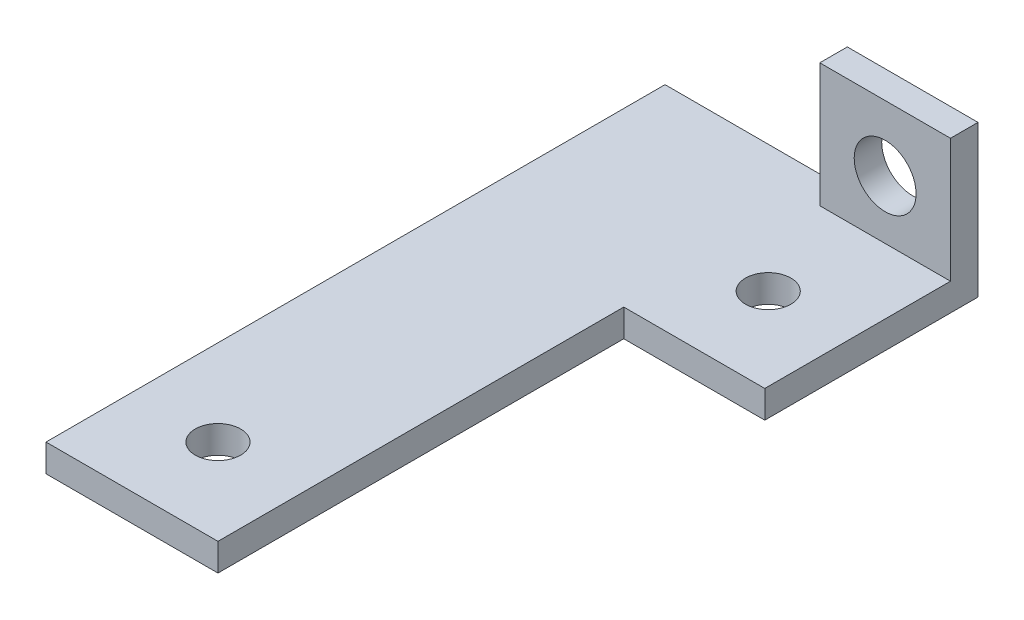
ISO-10303-21;
HEADER;
FILE_DESCRIPTION(('STEP AP214'),'2;1');
FILE_NAME('part.step','',(''),(''),'','','');
FILE_SCHEMA(('AUTOMOTIVE_DESIGN { 1 0 10303 214 1 1 1 1 }'));
ENDSEC;
DATA;
#1=APPLICATION_CONTEXT('core data for automotive mechanical design processes');
#2=APPLICATION_PROTOCOL_DEFINITION('international standard','automotive_design',2000,#1);
#3=PRODUCT_CONTEXT('',#1,'mechanical');
#4=PRODUCT('Part','Part','',(#3));
#5=PRODUCT_RELATED_PRODUCT_CATEGORY('part','',(#4));
#6=PRODUCT_DEFINITION_FORMATION('','',#4);
#7=PRODUCT_DEFINITION_CONTEXT('part definition',#1,'design');
#8=PRODUCT_DEFINITION('design','',#6,#7);
#9=PRODUCT_DEFINITION_SHAPE('','',#8);
#10=(LENGTH_UNIT() NAMED_UNIT(*) SI_UNIT(.MILLI.,.METRE.));
#11=(NAMED_UNIT(*) PLANE_ANGLE_UNIT() SI_UNIT($,.RADIAN.));
#12=(NAMED_UNIT(*) SI_UNIT($,.STERADIAN.) SOLID_ANGLE_UNIT());
#13=UNCERTAINTY_MEASURE_WITH_UNIT(LENGTH_MEASURE(1.E-05),#10,'distance_accuracy_value','');
#14=(GEOMETRIC_REPRESENTATION_CONTEXT(3) GLOBAL_UNCERTAINTY_ASSIGNED_CONTEXT((#13)) GLOBAL_UNIT_ASSIGNED_CONTEXT((#10,
#11,#12)) REPRESENTATION_CONTEXT('',''));
#15=CARTESIAN_POINT('',(0.,0.,0.));
#16=DIRECTION('',(0.,0.,1.));
#17=DIRECTION('',(1.,0.,0.));
#18=AXIS2_PLACEMENT_3D('',#15,#16,#17);
#19=CARTESIAN_POINT('',(0.,4.,0.));
#20=DIRECTION('',(0.,-1.,0.));
#21=DIRECTION('',(0.,0.,-1.));
#22=AXIS2_PLACEMENT_3D('',#19,#20,#21);
#23=PLANE('',#22);
#24=CARTESIAN_POINT('',(12.5,4.,-12.5));
#25=DIRECTION('',(0.,1.,0.));
#26=DIRECTION('',(0.,0.,1.));
#27=AXIS2_PLACEMENT_3D('',#24,#25,#26);
#28=CIRCLE('',#27,3.3);
#29=CARTESIAN_POINT('',(12.5,4.,-9.2));
#30=VERTEX_POINT('',#29);
#31=EDGE_CURVE('E133',#30,#30,#28,.T.);
#32=ORIENTED_EDGE('',*,*,#31,.F.);
#33=EDGE_LOOP('',(#32));
#34=FACE_BOUND('',#33,.T.);
#35=CARTESIAN_POINT('',(33.5,4.,-71.5));
#36=DIRECTION('',(0.,1.,0.));
#37=DIRECTION('',(0.,0.,1.));
#38=AXIS2_PLACEMENT_3D('',#35,#36,#37);
#39=CIRCLE('',#38,3.3);
#40=CARTESIAN_POINT('',(33.5,4.,-68.2));
#41=VERTEX_POINT('',#40);
#42=EDGE_CURVE('E142',#41,#41,#39,.T.);
#43=ORIENTED_EDGE('',*,*,#42,.F.);
#44=EDGE_LOOP('',(#43));
#45=FACE_BOUND('',#44,.T.);
#46=DIRECTION('',(1.,0.,0.));
#47=VECTOR('',#46,1.);
#48=CARTESIAN_POINT('',(45.5,4.,-86.));
#49=LINE('',#48,#47);
#50=CARTESIAN_POINT('',(26.5,4.,-86.));
#51=VERTEX_POINT('',#50);
#52=CARTESIAN_POINT('',(45.5,4.,-86.));
#53=VERTEX_POINT('',#52);
#54=EDGE_CURVE('E125',#51,#53,#49,.T.);
#55=ORIENTED_EDGE('',*,*,#54,.F.);
#56=DIRECTION('',(0.,0.,1.));
#57=VECTOR('',#56,1.);
#58=CARTESIAN_POINT('',(26.5,4.,-90.));
#59=LINE('',#58,#57);
#60=CARTESIAN_POINT('',(26.5,4.,-90.));
#61=VERTEX_POINT('',#60);
#62=EDGE_CURVE('E51',#61,#51,#59,.T.);
#63=ORIENTED_EDGE('',*,*,#62,.F.);
#64=DIRECTION('',(-1.,0.,0.));
#65=VECTOR('',#64,1.);
#66=CARTESIAN_POINT('',(0.,4.,-90.));
#67=LINE('',#66,#65);
#68=CARTESIAN_POINT('',(0.,4.,-90.));
#69=VERTEX_POINT('',#68);
#70=EDGE_CURVE('E129',#61,#69,#67,.T.);
#71=ORIENTED_EDGE('',*,*,#70,.T.);
#72=DIRECTION('',(0.,0.,1.));
#73=VECTOR('',#72,1.);
#74=CARTESIAN_POINT('',(0.,4.,0.));
#75=LINE('',#74,#73);
#76=CARTESIAN_POINT('',(0.,4.,0.));
#77=VERTEX_POINT('',#76);
#78=EDGE_CURVE('E148',#69,#77,#75,.T.);
#79=ORIENTED_EDGE('',*,*,#78,.T.);
#80=DIRECTION('',(1.,0.,0.));
#81=VECTOR('',#80,1.);
#82=CARTESIAN_POINT('',(0.,4.,0.));
#83=LINE('',#82,#81);
#84=CARTESIAN_POINT('',(25.,4.,0.));
#85=VERTEX_POINT('',#84);
#86=EDGE_CURVE('E151',#77,#85,#83,.T.);
#87=ORIENTED_EDGE('',*,*,#86,.T.);
#88=DIRECTION('',(0.,0.,-1.));
#89=VECTOR('',#88,1.);
#90=CARTESIAN_POINT('',(25.,4.,-59.));
#91=LINE('',#90,#89);
#92=CARTESIAN_POINT('',(25.,4.,-59.));
#93=VERTEX_POINT('',#92);
#94=EDGE_CURVE('E154',#85,#93,#91,.T.);
#95=ORIENTED_EDGE('',*,*,#94,.T.);
#96=DIRECTION('',(1.,0.,0.));
#97=VECTOR('',#96,1.);
#98=CARTESIAN_POINT('',(45.5,4.,-59.));
#99=LINE('',#98,#97);
#100=CARTESIAN_POINT('',(45.5,4.,-59.));
#101=VERTEX_POINT('',#100);
#102=EDGE_CURVE('E156',#93,#101,#99,.T.);
#103=ORIENTED_EDGE('',*,*,#102,.T.);
#104=DIRECTION('',(0.,0.,-1.));
#105=VECTOR('',#104,1.);
#106=CARTESIAN_POINT('',(45.5,4.,-90.));
#107=LINE('',#106,#105);
#108=EDGE_CURVE('E57',#101,#53,#107,.T.);
#109=ORIENTED_EDGE('',*,*,#108,.T.);
#110=EDGE_LOOP('',(#55,#63,#71,#79,#87,#95,#103,#109));
#111=FACE_BOUND('',#110,.T.);
#112=ADVANCED_FACE('F36',(#34,#45,#111),#23,.F.);
#113=CARTESIAN_POINT('',(0.,0.,0.));
#114=DIRECTION('',(0.,-1.,0.));
#115=DIRECTION('',(0.,0.,-1.));
#116=AXIS2_PLACEMENT_3D('',#113,#114,#115);
#117=PLANE('',#116);
#118=CARTESIAN_POINT('',(33.5,0.,-71.5));
#119=DIRECTION('',(0.,1.,0.));
#120=DIRECTION('',(0.,0.,1.));
#121=AXIS2_PLACEMENT_3D('',#118,#119,#120);
#122=CIRCLE('',#121,3.3);
#123=CARTESIAN_POINT('',(33.5,0.,-68.2));
#124=VERTEX_POINT('',#123);
#125=EDGE_CURVE('E140',#124,#124,#122,.T.);
#126=ORIENTED_EDGE('',*,*,#125,.T.);
#127=EDGE_LOOP('',(#126));
#128=FACE_BOUND('',#127,.T.);
#129=DIRECTION('',(0.,0.,1.));
#130=VECTOR('',#129,1.);
#131=CARTESIAN_POINT('',(0.,0.,0.));
#132=LINE('',#131,#130);
#133=CARTESIAN_POINT('',(0.,0.,-90.));
#134=VERTEX_POINT('',#133);
#135=CARTESIAN_POINT('',(0.,0.,0.));
#136=VERTEX_POINT('',#135);
#137=EDGE_CURVE('E145',#134,#136,#132,.T.);
#138=ORIENTED_EDGE('',*,*,#137,.F.);
#139=DIRECTION('',(-1.,0.,0.));
#140=VECTOR('',#139,1.);
#141=CARTESIAN_POINT('',(0.,0.,-90.));
#142=LINE('',#141,#140);
#143=CARTESIAN_POINT('',(45.5,0.,-90.));
#144=VERTEX_POINT('',#143);
#145=EDGE_CURVE('E152',#144,#134,#142,.T.);
#146=ORIENTED_EDGE('',*,*,#145,.F.);
#147=DIRECTION('',(0.,0.,-1.));
#148=VECTOR('',#147,1.);
#149=CARTESIAN_POINT('',(45.5,0.,-90.));
#150=LINE('',#149,#148);
#151=CARTESIAN_POINT('',(45.5,0.,-59.));
#152=VERTEX_POINT('',#151);
#153=EDGE_CURVE('E169',#152,#144,#150,.T.);
#154=ORIENTED_EDGE('',*,*,#153,.F.);
#155=DIRECTION('',(1.,0.,0.));
#156=VECTOR('',#155,1.);
#157=CARTESIAN_POINT('',(45.5,0.,-59.));
#158=LINE('',#157,#156);
#159=CARTESIAN_POINT('',(25.,0.,-59.));
#160=VERTEX_POINT('',#159);
#161=EDGE_CURVE('E167',#160,#152,#158,.T.);
#162=ORIENTED_EDGE('',*,*,#161,.F.);
#163=DIRECTION('',(0.,0.,-1.));
#164=VECTOR('',#163,1.);
#165=CARTESIAN_POINT('',(25.,0.,-59.));
#166=LINE('',#165,#164);
#167=CARTESIAN_POINT('',(25.,0.,0.));
#168=VERTEX_POINT('',#167);
#169=EDGE_CURVE('E165',#168,#160,#166,.T.);
#170=ORIENTED_EDGE('',*,*,#169,.F.);
#171=DIRECTION('',(1.,0.,0.));
#172=VECTOR('',#171,1.);
#173=CARTESIAN_POINT('',(0.,0.,0.));
#174=LINE('',#173,#172);
#175=EDGE_CURVE('E163',#136,#168,#174,.T.);
#176=ORIENTED_EDGE('',*,*,#175,.F.);
#177=EDGE_LOOP('',(#138,#146,#154,#162,#170,#176));
#178=FACE_BOUND('',#177,.T.);
#179=CARTESIAN_POINT('',(12.5,0.,-12.5));
#180=DIRECTION('',(0.,1.,0.));
#181=DIRECTION('',(0.,0.,1.));
#182=AXIS2_PLACEMENT_3D('',#179,#180,#181);
#183=CIRCLE('',#182,3.3);
#184=CARTESIAN_POINT('',(12.5,0.,-9.2));
#185=VERTEX_POINT('',#184);
#186=EDGE_CURVE('E130',#185,#185,#183,.T.);
#187=ORIENTED_EDGE('',*,*,#186,.T.);
#188=EDGE_LOOP('',(#187));
#189=FACE_BOUND('',#188,.T.);
#190=ADVANCED_FACE('F192',(#128,#178,#189),#117,.T.);
#191=CARTESIAN_POINT('',(0.,4.,0.));
#192=DIRECTION('',(1.,0.,0.));
#193=DIRECTION('',(0.,0.,-1.));
#194=AXIS2_PLACEMENT_3D('',#191,#192,#193);
#195=PLANE('',#194);
#196=ORIENTED_EDGE('',*,*,#137,.T.);
#197=DIRECTION('',(0.,-1.,0.));
#198=VECTOR('',#197,1.);
#199=CARTESIAN_POINT('',(0.,4.,0.));
#200=LINE('',#199,#198);
#201=EDGE_CURVE('E11',#77,#136,#200,.T.);
#202=ORIENTED_EDGE('',*,*,#201,.F.);
#203=ORIENTED_EDGE('',*,*,#78,.F.);
#204=DIRECTION('',(0.,-1.,0.));
#205=VECTOR('',#204,1.);
#206=CARTESIAN_POINT('',(0.,4.,-90.));
#207=LINE('',#206,#205);
#208=EDGE_CURVE('E160',#69,#134,#207,.T.);
#209=ORIENTED_EDGE('',*,*,#208,.T.);
#210=EDGE_LOOP('',(#196,#202,#203,#209));
#211=FACE_BOUND('',#210,.T.);
#212=ADVANCED_FACE('F38',(#211),#195,.F.);
#213=CARTESIAN_POINT('',(0.,4.,0.));
#214=DIRECTION('',(0.,0.,-1.));
#215=DIRECTION('',(-1.,0.,0.));
#216=AXIS2_PLACEMENT_3D('',#213,#214,#215);
#217=PLANE('',#216);
#218=ORIENTED_EDGE('',*,*,#175,.T.);
#219=DIRECTION('',(0.,-1.,0.));
#220=VECTOR('',#219,1.);
#221=CARTESIAN_POINT('',(25.,4.,0.));
#222=LINE('',#221,#220);
#223=EDGE_CURVE('E44',#85,#168,#222,.T.);
#224=ORIENTED_EDGE('',*,*,#223,.F.);
#225=ORIENTED_EDGE('',*,*,#86,.F.);
#226=ORIENTED_EDGE('',*,*,#201,.T.);
#227=EDGE_LOOP('',(#218,#224,#225,#226));
#228=FACE_BOUND('',#227,.T.);
#229=ADVANCED_FACE('F320',(#228),#217,.F.);
#230=CARTESIAN_POINT('',(25.,4.,-59.));
#231=DIRECTION('',(-1.,0.,0.));
#232=DIRECTION('',(0.,0.,1.));
#233=AXIS2_PLACEMENT_3D('',#230,#231,#232);
#234=PLANE('',#233);
#235=ORIENTED_EDGE('',*,*,#169,.T.);
#236=DIRECTION('',(0.,-1.,0.));
#237=VECTOR('',#236,1.);
#238=CARTESIAN_POINT('',(25.,4.,-59.));
#239=LINE('',#238,#237);
#240=EDGE_CURVE('E179',#93,#160,#239,.T.);
#241=ORIENTED_EDGE('',*,*,#240,.F.);
#242=ORIENTED_EDGE('',*,*,#94,.F.);
#243=ORIENTED_EDGE('',*,*,#223,.T.);
#244=EDGE_LOOP('',(#235,#241,#242,#243));
#245=FACE_BOUND('',#244,.T.);
#246=ADVANCED_FACE('F186',(#245),#234,.F.);
#247=CARTESIAN_POINT('',(45.5,4.,-59.));
#248=DIRECTION('',(0.,0.,-1.));
#249=DIRECTION('',(-1.,0.,0.));
#250=AXIS2_PLACEMENT_3D('',#247,#248,#249);
#251=PLANE('',#250);
#252=ORIENTED_EDGE('',*,*,#161,.T.);
#253=DIRECTION('',(0.,-1.,0.));
#254=VECTOR('',#253,1.);
#255=CARTESIAN_POINT('',(45.5,4.,-59.));
#256=LINE('',#255,#254);
#257=EDGE_CURVE('E176',#101,#152,#256,.T.);
#258=ORIENTED_EDGE('',*,*,#257,.F.);
#259=ORIENTED_EDGE('',*,*,#102,.F.);
#260=ORIENTED_EDGE('',*,*,#240,.T.);
#261=EDGE_LOOP('',(#252,#258,#259,#260));
#262=FACE_BOUND('',#261,.T.);
#263=ADVANCED_FACE('F198',(#262),#251,.F.);
#264=CARTESIAN_POINT('',(45.5,4.,-90.));
#265=DIRECTION('',(-1.,0.,0.));
#266=DIRECTION('',(0.,0.,1.));
#267=AXIS2_PLACEMENT_3D('',#264,#265,#266);
#268=PLANE('',#267);
#269=ORIENTED_EDGE('',*,*,#153,.T.);
#270=DIRECTION('',(0.,-1.,0.));
#271=VECTOR('',#270,1.);
#272=CARTESIAN_POINT('',(45.5,4.,-90.));
#273=LINE('',#272,#271);
#274=CARTESIAN_POINT('',(45.5,22.,-90.));
#275=VERTEX_POINT('',#274);
#276=EDGE_CURVE('E174',#275,#144,#273,.T.);
#277=ORIENTED_EDGE('',*,*,#276,.F.);
#278=DIRECTION('',(0.,0.,-1.));
#279=VECTOR('',#278,1.);
#280=CARTESIAN_POINT('',(45.5,22.,-90.));
#281=LINE('',#280,#279);
#282=CARTESIAN_POINT('',(45.5,22.,-86.));
#283=VERTEX_POINT('',#282);
#284=EDGE_CURVE('E122',#283,#275,#281,.T.);
#285=ORIENTED_EDGE('',*,*,#284,.F.);
#286=DIRECTION('',(0.,-1.,0.));
#287=VECTOR('',#286,1.);
#288=CARTESIAN_POINT('',(45.5,22.,-86.));
#289=LINE('',#288,#287);
#290=EDGE_CURVE('E135',#283,#53,#289,.T.);
#291=ORIENTED_EDGE('',*,*,#290,.T.);
#292=ORIENTED_EDGE('',*,*,#108,.F.);
#293=ORIENTED_EDGE('',*,*,#257,.T.);
#294=EDGE_LOOP('',(#269,#277,#285,#291,#292,#293));
#295=FACE_BOUND('',#294,.T.);
#296=ADVANCED_FACE('F201',(#295),#268,.F.);
#297=CARTESIAN_POINT('',(0.,4.,-90.));
#298=DIRECTION('',(0.,0.,1.));
#299=DIRECTION('',(1.,0.,0.));
#300=AXIS2_PLACEMENT_3D('',#297,#298,#299);
#301=PLANE('',#300);
#302=CARTESIAN_POINT('',(36.,12.5,-90.));
#303=DIRECTION('',(0.,0.,-1.));
#304=DIRECTION('',(-1.,0.,0.));
#305=AXIS2_PLACEMENT_3D('',#302,#303,#304);
#306=CIRCLE('',#305,4.5);
#307=CARTESIAN_POINT('',(31.5,12.5,-90.));
#308=VERTEX_POINT('',#307);
#309=EDGE_CURVE('E211',#308,#308,#306,.T.);
#310=ORIENTED_EDGE('',*,*,#309,.F.);
#311=EDGE_LOOP('',(#310));
#312=FACE_BOUND('',#311,.T.);
#313=ORIENTED_EDGE('',*,*,#145,.T.);
#314=ORIENTED_EDGE('',*,*,#208,.F.);
#315=ORIENTED_EDGE('',*,*,#70,.F.);
#316=DIRECTION('',(0.,-1.,0.));
#317=VECTOR('',#316,1.);
#318=CARTESIAN_POINT('',(26.5,22.,-90.));
#319=LINE('',#318,#317);
#320=CARTESIAN_POINT('',(26.5,22.,-90.));
#321=VERTEX_POINT('',#320);
#322=EDGE_CURVE('E110',#321,#61,#319,.T.);
#323=ORIENTED_EDGE('',*,*,#322,.F.);
#324=DIRECTION('',(-1.,0.,0.));
#325=VECTOR('',#324,1.);
#326=CARTESIAN_POINT('',(45.5,22.,-90.));
#327=LINE('',#326,#325);
#328=EDGE_CURVE('E116',#275,#321,#327,.T.);
#329=ORIENTED_EDGE('',*,*,#328,.F.);
#330=ORIENTED_EDGE('',*,*,#276,.T.);
#331=EDGE_LOOP('',(#313,#314,#315,#323,#329,#330));
#332=FACE_BOUND('',#331,.T.);
#333=ADVANCED_FACE('F127',(#312,#332),#301,.F.);
#334=CARTESIAN_POINT('',(33.5,4.,-71.5));
#335=DIRECTION('',(0.,-1.,0.));
#336=DIRECTION('',(0.,0.,-1.));
#337=AXIS2_PLACEMENT_3D('',#334,#335,#336);
#338=CYLINDRICAL_SURFACE('',#337,3.3);
#339=ORIENTED_EDGE('',*,*,#42,.T.);
#340=EDGE_LOOP('',(#339));
#341=FACE_BOUND('',#340,.T.);
#342=ORIENTED_EDGE('',*,*,#125,.F.);
#343=EDGE_LOOP('',(#342));
#344=FACE_BOUND('',#343,.T.);
#345=ADVANCED_FACE('F226',(#341,#344),#338,.F.);
#346=CARTESIAN_POINT('',(12.5,4.,-12.5));
#347=DIRECTION('',(0.,-1.,0.));
#348=DIRECTION('',(0.,0.,-1.));
#349=AXIS2_PLACEMENT_3D('',#346,#347,#348);
#350=CYLINDRICAL_SURFACE('',#349,3.3);
#351=ORIENTED_EDGE('',*,*,#31,.T.);
#352=EDGE_LOOP('',(#351));
#353=FACE_BOUND('',#352,.T.);
#354=ORIENTED_EDGE('',*,*,#186,.F.);
#355=EDGE_LOOP('',(#354));
#356=FACE_BOUND('',#355,.T.);
#357=ADVANCED_FACE('F232',(#353,#356),#350,.F.);
#358=CARTESIAN_POINT('',(26.5,22.,-90.));
#359=DIRECTION('',(1.,0.,0.));
#360=DIRECTION('',(0.,0.,-1.));
#361=AXIS2_PLACEMENT_3D('',#358,#359,#360);
#362=PLANE('',#361);
#363=ORIENTED_EDGE('',*,*,#62,.T.);
#364=DIRECTION('',(0.,-1.,0.));
#365=VECTOR('',#364,1.);
#366=CARTESIAN_POINT('',(26.5,22.,-86.));
#367=LINE('',#366,#365);
#368=CARTESIAN_POINT('',(26.5,22.,-86.));
#369=VERTEX_POINT('',#368);
#370=EDGE_CURVE('E112',#369,#51,#367,.T.);
#371=ORIENTED_EDGE('',*,*,#370,.F.);
#372=DIRECTION('',(0.,0.,1.));
#373=VECTOR('',#372,1.);
#374=CARTESIAN_POINT('',(26.5,22.,-90.));
#375=LINE('',#374,#373);
#376=EDGE_CURVE('E106',#321,#369,#375,.T.);
#377=ORIENTED_EDGE('',*,*,#376,.F.);
#378=ORIENTED_EDGE('',*,*,#322,.T.);
#379=EDGE_LOOP('',(#363,#371,#377,#378));
#380=FACE_BOUND('',#379,.T.);
#381=ADVANCED_FACE('F108',(#380),#362,.F.);
#382=CARTESIAN_POINT('',(45.5,22.,-86.));
#383=DIRECTION('',(0.,0.,-1.));
#384=DIRECTION('',(-1.,0.,0.));
#385=AXIS2_PLACEMENT_3D('',#382,#383,#384);
#386=PLANE('',#385);
#387=CARTESIAN_POINT('',(36.,12.5,-86.));
#388=DIRECTION('',(0.,0.,-1.));
#389=DIRECTION('',(-1.,0.,0.));
#390=AXIS2_PLACEMENT_3D('',#387,#388,#389);
#391=CIRCLE('',#390,4.5);
#392=CARTESIAN_POINT('',(31.5,12.5,-86.));
#393=VERTEX_POINT('',#392);
#394=EDGE_CURVE('E208',#393,#393,#391,.T.);
#395=ORIENTED_EDGE('',*,*,#394,.T.);
#396=EDGE_LOOP('',(#395));
#397=FACE_BOUND('',#396,.T.);
#398=ORIENTED_EDGE('',*,*,#54,.T.);
#399=ORIENTED_EDGE('',*,*,#290,.F.);
#400=DIRECTION('',(1.,0.,0.));
#401=VECTOR('',#400,1.);
#402=CARTESIAN_POINT('',(45.5,22.,-86.));
#403=LINE('',#402,#401);
#404=EDGE_CURVE('E115',#369,#283,#403,.T.);
#405=ORIENTED_EDGE('',*,*,#404,.F.);
#406=ORIENTED_EDGE('',*,*,#370,.T.);
#407=EDGE_LOOP('',(#398,#399,#405,#406));
#408=FACE_BOUND('',#407,.T.);
#409=ADVANCED_FACE('F217',(#397,#408),#386,.F.);
#410=CARTESIAN_POINT('',(0.,22.,0.));
#411=DIRECTION('',(0.,1.,0.));
#412=DIRECTION('',(0.,0.,1.));
#413=AXIS2_PLACEMENT_3D('',#410,#411,#412);
#414=PLANE('',#413);
#415=ORIENTED_EDGE('',*,*,#328,.T.);
#416=ORIENTED_EDGE('',*,*,#376,.T.);
#417=ORIENTED_EDGE('',*,*,#404,.T.);
#418=ORIENTED_EDGE('',*,*,#284,.T.);
#419=EDGE_LOOP('',(#415,#416,#417,#418));
#420=FACE_BOUND('',#419,.T.);
#421=ADVANCED_FACE('F120',(#420),#414,.T.);
#422=CARTESIAN_POINT('',(36.,12.5,-86.));
#423=DIRECTION('',(0.,0.,-1.));
#424=DIRECTION('',(-1.,0.,0.));
#425=AXIS2_PLACEMENT_3D('',#422,#423,#424);
#426=CYLINDRICAL_SURFACE('',#425,4.5);
#427=ORIENTED_EDGE('',*,*,#394,.F.);
#428=EDGE_LOOP('',(#427));
#429=FACE_BOUND('',#428,.T.);
#430=ORIENTED_EDGE('',*,*,#309,.T.);
#431=EDGE_LOOP('',(#430));
#432=FACE_BOUND('',#431,.T.);
#433=ADVANCED_FACE('F219',(#429,#432),#426,.F.);
#434=CLOSED_SHELL('',(#112,#190,#212,#229,#246,#263,#296,#333,#345,#357,#381,#409,#421,#433));
#435=MANIFOLD_SOLID_BREP('B2',#434);
#436=ADVANCED_BREP_SHAPE_REPRESENTATION('',(#18,#435),#14);
#437=SHAPE_DEFINITION_REPRESENTATION(#9,#436);
ENDSEC;
END-ISO-10303-21;
